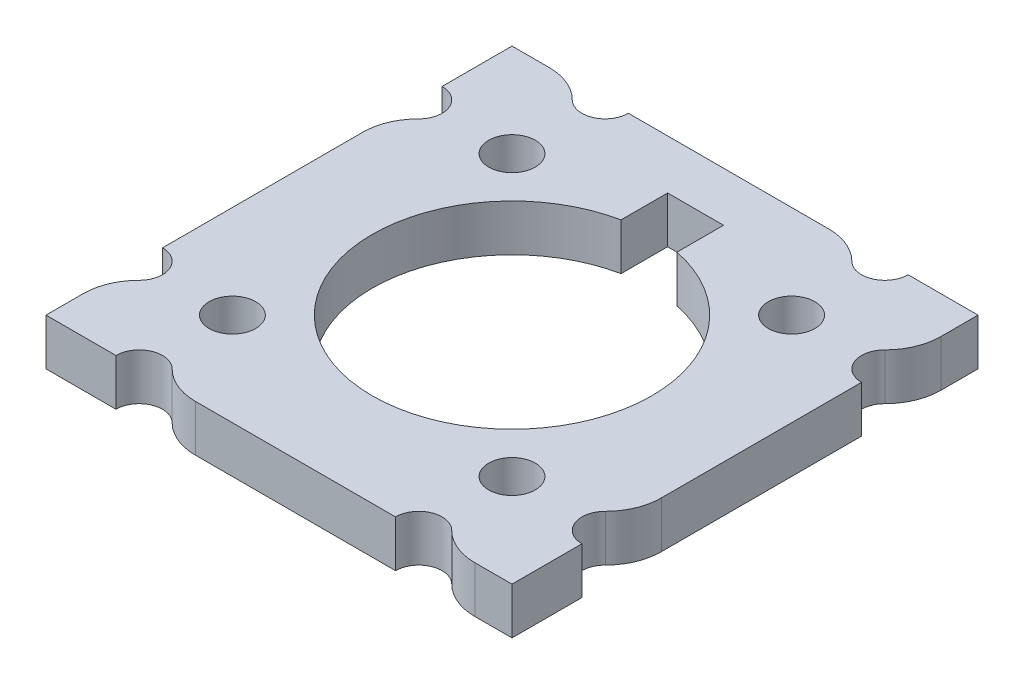
ISO-10303-21;
HEADER;
FILE_DESCRIPTION(('STEP AP214'),'2;1');
FILE_NAME('part.step','',(''),(''),'','','');
FILE_SCHEMA(('AUTOMOTIVE_DESIGN { 1 0 10303 214 1 1 1 1 }'));
ENDSEC;
DATA;
#1=APPLICATION_CONTEXT('core data for automotive mechanical design processes');
#2=APPLICATION_PROTOCOL_DEFINITION('international standard','automotive_design',2000,#1);
#3=PRODUCT_CONTEXT('',#1,'mechanical');
#4=PRODUCT('Part','Part','',(#3));
#5=PRODUCT_RELATED_PRODUCT_CATEGORY('part','',(#4));
#6=PRODUCT_DEFINITION_FORMATION('','',#4);
#7=PRODUCT_DEFINITION_CONTEXT('part definition',#1,'design');
#8=PRODUCT_DEFINITION('design','',#6,#7);
#9=PRODUCT_DEFINITION_SHAPE('','',#8);
#10=(LENGTH_UNIT() NAMED_UNIT(*) SI_UNIT(.MILLI.,.METRE.));
#11=(NAMED_UNIT(*) PLANE_ANGLE_UNIT() SI_UNIT($,.RADIAN.));
#12=(NAMED_UNIT(*) SI_UNIT($,.STERADIAN.) SOLID_ANGLE_UNIT());
#13=UNCERTAINTY_MEASURE_WITH_UNIT(LENGTH_MEASURE(1.E-05),#10,'distance_accuracy_value','');
#14=(GEOMETRIC_REPRESENTATION_CONTEXT(3) GLOBAL_UNCERTAINTY_ASSIGNED_CONTEXT((#13)) GLOBAL_UNIT_ASSIGNED_CONTEXT((#10,
#11,#12)) REPRESENTATION_CONTEXT('',''));
#15=CARTESIAN_POINT('',(0.,0.,0.));
#16=DIRECTION('',(0.,0.,1.));
#17=DIRECTION('',(1.,0.,0.));
#18=AXIS2_PLACEMENT_3D('',#15,#16,#17);
#19=CARTESIAN_POINT('',(25.,5.,-25.));
#20=DIRECTION('',(-1.,0.,0.));
#21=DIRECTION('',(0.,0.,1.));
#22=AXIS2_PLACEMENT_3D('',#19,#20,#21);
#23=PLANE('',#22);
#24=DIRECTION('',(0.,0.,-1.));
#25=VECTOR('',#24,1.);
#26=CARTESIAN_POINT('',(25.,0.,-25.));
#27=LINE('',#26,#25);
#28=CARTESIAN_POINT('',(25.,0.,25.));
#29=VERTEX_POINT('',#28);
#30=CARTESIAN_POINT('',(25.,0.,17.5));
#31=VERTEX_POINT('',#30);
#32=EDGE_CURVE('E420',#29,#31,#27,.T.);
#33=ORIENTED_EDGE('',*,*,#32,.T.);
#34=DIRECTION('',(0.,1.,0.));
#35=VECTOR('',#34,1.);
#36=CARTESIAN_POINT('',(25.,0.,17.5));
#37=LINE('',#36,#35);
#38=CARTESIAN_POINT('',(25.,5.,17.5));
#39=VERTEX_POINT('',#38);
#40=EDGE_CURVE('E486',#31,#39,#37,.T.);
#41=ORIENTED_EDGE('',*,*,#40,.T.);
#42=DIRECTION('',(0.,0.,-1.));
#43=VECTOR('',#42,1.);
#44=CARTESIAN_POINT('',(25.,5.,-25.));
#45=LINE('',#44,#43);
#46=CARTESIAN_POINT('',(25.,5.,25.));
#47=VERTEX_POINT('',#46);
#48=EDGE_CURVE('E395',#47,#39,#45,.T.);
#49=ORIENTED_EDGE('',*,*,#48,.F.);
#50=DIRECTION('',(0.,-1.,0.));
#51=VECTOR('',#50,1.);
#52=CARTESIAN_POINT('',(25.,5.,25.));
#53=LINE('',#52,#51);
#54=EDGE_CURVE('E418',#47,#29,#53,.T.);
#55=ORIENTED_EDGE('',*,*,#54,.T.);
#56=EDGE_LOOP('',(#33,#41,#49,#55));
#57=FACE_BOUND('',#56,.T.);
#58=ADVANCED_FACE('F45',(#57),#23,.F.);
#59=CARTESIAN_POINT('',(25.,5.,8.97920271060383));
#60=VERTEX_POINT('',#59);
#61=CARTESIAN_POINT('',(25.,5.,-12.5));
#62=VERTEX_POINT('',#61);
#63=EDGE_CURVE('E400',#60,#62,#45,.T.);
#64=ORIENTED_EDGE('',*,*,#63,.F.);
#65=DIRECTION('',(0.,1.,0.));
#66=VECTOR('',#65,1.);
#67=CARTESIAN_POINT('',(25.,5.,8.97920271060383));
#68=LINE('',#67,#66);
#69=CARTESIAN_POINT('',(25.,0.,8.97920271060383));
#70=VERTEX_POINT('',#69);
#71=EDGE_CURVE('E578',#60,#70,#68,.F.);
#72=ORIENTED_EDGE('',*,*,#71,.T.);
#73=CARTESIAN_POINT('',(25.,0.,-12.5));
#74=VERTEX_POINT('',#73);
#75=EDGE_CURVE('E425',#70,#74,#27,.T.);
#76=ORIENTED_EDGE('',*,*,#75,.T.);
#77=DIRECTION('',(0.,1.,0.));
#78=VECTOR('',#77,1.);
#79=CARTESIAN_POINT('',(25.,0.,-12.5));
#80=LINE('',#79,#78);
#81=EDGE_CURVE('E482',#74,#62,#80,.T.);
#82=ORIENTED_EDGE('',*,*,#81,.T.);
#83=EDGE_LOOP('',(#64,#72,#76,#82));
#84=FACE_BOUND('',#83,.T.);
#85=ADVANCED_FACE('F633',(#84),#23,.F.);
#86=CARTESIAN_POINT('',(-25.,5.,-25.));
#87=DIRECTION('',(0.,0.,1.));
#88=DIRECTION('',(1.,0.,0.));
#89=AXIS2_PLACEMENT_3D('',#86,#87,#88);
#90=PLANE('',#89);
#91=DIRECTION('',(-1.,0.,0.));
#92=VECTOR('',#91,1.);
#93=CARTESIAN_POINT('',(-25.,5.,-25.));
#94=LINE('',#93,#92);
#95=CARTESIAN_POINT('',(8.97920271060386,5.,-25.));
#96=VERTEX_POINT('',#95);
#97=CARTESIAN_POINT('',(-12.5,5.,-25.));
#98=VERTEX_POINT('',#97);
#99=EDGE_CURVE('E407',#96,#98,#94,.T.);
#100=ORIENTED_EDGE('',*,*,#99,.F.);
#101=DIRECTION('',(0.,1.,0.));
#102=VECTOR('',#101,1.);
#103=CARTESIAN_POINT('',(8.97920271060386,5.,-25.));
#104=LINE('',#103,#102);
#105=CARTESIAN_POINT('',(8.97920271060386,0.,-25.));
#106=VERTEX_POINT('',#105);
#107=EDGE_CURVE('E565',#96,#106,#104,.F.);
#108=ORIENTED_EDGE('',*,*,#107,.T.);
#109=DIRECTION('',(-1.,0.,0.));
#110=VECTOR('',#109,1.);
#111=CARTESIAN_POINT('',(-25.,0.,-25.));
#112=LINE('',#111,#110);
#113=CARTESIAN_POINT('',(-12.5,0.,-25.));
#114=VERTEX_POINT('',#113);
#115=EDGE_CURVE('E431',#106,#114,#112,.T.);
#116=ORIENTED_EDGE('',*,*,#115,.T.);
#117=DIRECTION('',(0.,1.,0.));
#118=VECTOR('',#117,1.);
#119=CARTESIAN_POINT('',(-12.5,0.,-25.));
#120=LINE('',#119,#118);
#121=EDGE_CURVE('E478',#114,#98,#120,.T.);
#122=ORIENTED_EDGE('',*,*,#121,.T.);
#123=EDGE_LOOP('',(#100,#108,#116,#122));
#124=FACE_BOUND('',#123,.T.);
#125=ADVANCED_FACE('F675',(#124),#90,.F.);
#126=CARTESIAN_POINT('',(25.,0.,-25.));
#127=VERTEX_POINT('',#126);
#128=CARTESIAN_POINT('',(17.5,0.,-25.));
#129=VERTEX_POINT('',#128);
#130=EDGE_CURVE('E426',#127,#129,#112,.T.);
#131=ORIENTED_EDGE('',*,*,#130,.T.);
#132=DIRECTION('',(0.,1.,0.));
#133=VECTOR('',#132,1.);
#134=CARTESIAN_POINT('',(17.5,0.,-25.));
#135=LINE('',#134,#133);
#136=CARTESIAN_POINT('',(17.5,5.,-25.));
#137=VERTEX_POINT('',#136);
#138=EDGE_CURVE('E474',#129,#137,#135,.T.);
#139=ORIENTED_EDGE('',*,*,#138,.T.);
#140=CARTESIAN_POINT('',(25.,5.,-25.));
#141=VERTEX_POINT('',#140);
#142=EDGE_CURVE('E402',#141,#137,#94,.T.);
#143=ORIENTED_EDGE('',*,*,#142,.F.);
#144=DIRECTION('',(0.,-1.,0.));
#145=VECTOR('',#144,1.);
#146=CARTESIAN_POINT('',(25.,5.,-25.));
#147=LINE('',#146,#145);
#148=EDGE_CURVE('E454',#141,#127,#147,.T.);
#149=ORIENTED_EDGE('',*,*,#148,.T.);
#150=EDGE_LOOP('',(#131,#139,#143,#149));
#151=FACE_BOUND('',#150,.T.);
#152=ADVANCED_FACE('F648',(#151),#90,.F.);
#153=CARTESIAN_POINT('',(-25.,5.,-25.));
#154=DIRECTION('',(1.,0.,0.));
#155=DIRECTION('',(0.,0.,-1.));
#156=AXIS2_PLACEMENT_3D('',#153,#154,#155);
#157=PLANE('',#156);
#158=DIRECTION('',(0.,0.,1.));
#159=VECTOR('',#158,1.);
#160=CARTESIAN_POINT('',(-25.,5.,-25.));
#161=LINE('',#160,#159);
#162=CARTESIAN_POINT('',(-25.,5.,-8.97920271060368));
#163=VERTEX_POINT('',#162);
#164=CARTESIAN_POINT('',(-25.,5.,12.5000000000003));
#165=VERTEX_POINT('',#164);
#166=EDGE_CURVE('E413',#163,#165,#161,.T.);
#167=ORIENTED_EDGE('',*,*,#166,.F.);
#168=DIRECTION('',(0.,1.,0.));
#169=VECTOR('',#168,1.);
#170=CARTESIAN_POINT('',(-25.,5.,-8.97920271060368));
#171=LINE('',#170,#169);
#172=CARTESIAN_POINT('',(-25.,0.,-8.97920271060368));
#173=VERTEX_POINT('',#172);
#174=EDGE_CURVE('E551',#163,#173,#171,.F.);
#175=ORIENTED_EDGE('',*,*,#174,.T.);
#176=DIRECTION('',(0.,0.,1.));
#177=VECTOR('',#176,1.);
#178=CARTESIAN_POINT('',(-25.,0.,-25.));
#179=LINE('',#178,#177);
#180=CARTESIAN_POINT('',(-25.,0.,12.5000000000003));
#181=VERTEX_POINT('',#180);
#182=EDGE_CURVE('E437',#173,#181,#179,.T.);
#183=ORIENTED_EDGE('',*,*,#182,.T.);
#184=DIRECTION('',(0.,1.,0.));
#185=VECTOR('',#184,1.);
#186=CARTESIAN_POINT('',(-25.,0.,12.5000000000003));
#187=LINE('',#186,#185);
#188=EDGE_CURVE('E470',#181,#165,#187,.T.);
#189=ORIENTED_EDGE('',*,*,#188,.T.);
#190=EDGE_LOOP('',(#167,#175,#183,#189));
#191=FACE_BOUND('',#190,.T.);
#192=ADVANCED_FACE('F700',(#191),#157,.F.);
#193=CARTESIAN_POINT('',(-25.,0.,-25.));
#194=VERTEX_POINT('',#193);
#195=CARTESIAN_POINT('',(-25.,0.,-17.4999999999998));
#196=VERTEX_POINT('',#195);
#197=EDGE_CURVE('E432',#194,#196,#179,.T.);
#198=ORIENTED_EDGE('',*,*,#197,.T.);
#199=DIRECTION('',(0.,1.,0.));
#200=VECTOR('',#199,1.);
#201=CARTESIAN_POINT('',(-25.,0.,-17.4999999999998));
#202=LINE('',#201,#200);
#203=CARTESIAN_POINT('',(-25.,5.,-17.4999999999998));
#204=VERTEX_POINT('',#203);
#205=EDGE_CURVE('E466',#196,#204,#202,.T.);
#206=ORIENTED_EDGE('',*,*,#205,.T.);
#207=CARTESIAN_POINT('',(-25.,5.,-25.));
#208=VERTEX_POINT('',#207);
#209=EDGE_CURVE('E408',#208,#204,#161,.T.);
#210=ORIENTED_EDGE('',*,*,#209,.F.);
#211=DIRECTION('',(0.,-1.,0.));
#212=VECTOR('',#211,1.);
#213=CARTESIAN_POINT('',(-25.,5.,-25.));
#214=LINE('',#213,#212);
#215=EDGE_CURVE('E450',#208,#194,#214,.T.);
#216=ORIENTED_EDGE('',*,*,#215,.T.);
#217=EDGE_LOOP('',(#198,#206,#210,#216));
#218=FACE_BOUND('',#217,.T.);
#219=ADVANCED_FACE('F701',(#218),#157,.F.);
#220=CARTESIAN_POINT('',(-25.,5.,25.));
#221=DIRECTION('',(0.,0.,-1.));
#222=DIRECTION('',(-1.,0.,0.));
#223=AXIS2_PLACEMENT_3D('',#220,#221,#222);
#224=PLANE('',#223);
#225=DIRECTION('',(1.,0.,0.));
#226=VECTOR('',#225,1.);
#227=CARTESIAN_POINT('',(-25.,5.,25.));
#228=LINE('',#227,#226);
#229=CARTESIAN_POINT('',(-8.97920271060385,5.,25.));
#230=VERTEX_POINT('',#229);
#231=CARTESIAN_POINT('',(12.5,5.,25.));
#232=VERTEX_POINT('',#231);
#233=EDGE_CURVE('E419',#230,#232,#228,.T.);
#234=ORIENTED_EDGE('',*,*,#233,.F.);
#235=DIRECTION('',(0.,1.,0.));
#236=VECTOR('',#235,1.);
#237=CARTESIAN_POINT('',(-8.97920271060385,5.,25.));
#238=LINE('',#237,#236);
#239=CARTESIAN_POINT('',(-8.97920271060385,0.,25.));
#240=VERTEX_POINT('',#239);
#241=EDGE_CURVE('E490',#230,#240,#238,.F.);
#242=ORIENTED_EDGE('',*,*,#241,.T.);
#243=DIRECTION('',(1.,0.,0.));
#244=VECTOR('',#243,1.);
#245=CARTESIAN_POINT('',(-25.,0.,25.));
#246=LINE('',#245,#244);
#247=CARTESIAN_POINT('',(12.5,0.,25.));
#248=VERTEX_POINT('',#247);
#249=EDGE_CURVE('E442',#240,#248,#246,.T.);
#250=ORIENTED_EDGE('',*,*,#249,.T.);
#251=DIRECTION('',(0.,1.,0.));
#252=VECTOR('',#251,1.);
#253=CARTESIAN_POINT('',(12.5,0.,25.));
#254=LINE('',#253,#252);
#255=EDGE_CURVE('E462',#248,#232,#254,.T.);
#256=ORIENTED_EDGE('',*,*,#255,.T.);
#257=EDGE_LOOP('',(#234,#242,#250,#256));
#258=FACE_BOUND('',#257,.T.);
#259=ADVANCED_FACE('F604',(#258),#224,.F.);
#260=CARTESIAN_POINT('',(-25.,0.,25.));
#261=VERTEX_POINT('',#260);
#262=CARTESIAN_POINT('',(-17.5,0.,25.));
#263=VERTEX_POINT('',#262);
#264=EDGE_CURVE('E438',#261,#263,#246,.T.);
#265=ORIENTED_EDGE('',*,*,#264,.T.);
#266=DIRECTION('',(0.,1.,0.));
#267=VECTOR('',#266,1.);
#268=CARTESIAN_POINT('',(-17.5,0.,25.));
#269=LINE('',#268,#267);
#270=CARTESIAN_POINT('',(-17.5,5.,25.));
#271=VERTEX_POINT('',#270);
#272=EDGE_CURVE('E458',#263,#271,#269,.T.);
#273=ORIENTED_EDGE('',*,*,#272,.T.);
#274=CARTESIAN_POINT('',(-25.,5.,25.));
#275=VERTEX_POINT('',#274);
#276=EDGE_CURVE('E414',#275,#271,#228,.T.);
#277=ORIENTED_EDGE('',*,*,#276,.F.);
#278=DIRECTION('',(0.,-1.,0.));
#279=VECTOR('',#278,1.);
#280=CARTESIAN_POINT('',(-25.,5.,25.));
#281=LINE('',#280,#279);
#282=EDGE_CURVE('E446',#275,#261,#281,.T.);
#283=ORIENTED_EDGE('',*,*,#282,.T.);
#284=EDGE_LOOP('',(#265,#273,#277,#283));
#285=FACE_BOUND('',#284,.T.);
#286=ADVANCED_FACE('F690',(#285),#224,.F.);
#287=CARTESIAN_POINT('',(0.,5.,0.));
#288=DIRECTION('',(0.,1.,0.));
#289=DIRECTION('',(0.,0.,1.));
#290=AXIS2_PLACEMENT_3D('',#287,#288,#289);
#291=PLANE('',#290);
#292=DIRECTION('',(0.,0.,1.));
#293=VECTOR('',#292,1.);
#294=CARTESIAN_POINT('',(-3.,5.,-19.6969384566991));
#295=LINE('',#294,#293);
#296=CARTESIAN_POINT('',(-3.,5.,-19.6969384566991));
#297=VERTEX_POINT('',#296);
#298=CARTESIAN_POINT('',(-3.,5.,-14.6969384566991));
#299=VERTEX_POINT('',#298);
#300=EDGE_CURVE('E262',#297,#299,#295,.T.);
#301=ORIENTED_EDGE('',*,*,#300,.F.);
#302=DIRECTION('',(-1.,0.,0.));
#303=VECTOR('',#302,1.);
#304=CARTESIAN_POINT('',(-3.,5.,-19.6969384566991));
#305=LINE('',#304,#303);
#306=CARTESIAN_POINT('',(3.,5.,-19.6969384566991));
#307=VERTEX_POINT('',#306);
#308=EDGE_CURVE('E283',#307,#297,#305,.T.);
#309=ORIENTED_EDGE('',*,*,#308,.F.);
#310=DIRECTION('',(0.,0.,-1.));
#311=VECTOR('',#310,1.);
#312=CARTESIAN_POINT('',(3.,5.,-19.6969384566991));
#313=LINE('',#312,#311);
#314=CARTESIAN_POINT('',(3.,5.,-14.6969384566991));
#315=VERTEX_POINT('',#314);
#316=EDGE_CURVE('E287',#315,#307,#313,.T.);
#317=ORIENTED_EDGE('',*,*,#316,.F.);
#318=CARTESIAN_POINT('',(0.,5.,0.));
#319=DIRECTION('',(0.,1.,0.));
#320=DIRECTION('',(0.,0.,1.));
#321=AXIS2_PLACEMENT_3D('',#318,#319,#320);
#322=CIRCLE('',#321,15.);
#323=EDGE_CURVE('E296',#299,#315,#322,.T.);
#324=ORIENTED_EDGE('',*,*,#323,.F.);
#325=EDGE_LOOP('',(#301,#309,#317,#324));
#326=FACE_BOUND('',#325,.T.);
#327=CARTESIAN_POINT('',(-15.,5.,25.));
#328=DIRECTION('',(0.,1.,0.));
#329=DIRECTION('',(0.,0.,-1.));
#330=AXIS2_PLACEMENT_3D('',#327,#328,#329);
#331=CIRCLE('',#330,2.5);
#332=CARTESIAN_POINT('',(-13.2291772678247,5.,23.2352941176471));
#333=VERTEX_POINT('',#332);
#334=EDGE_CURVE('E324',#333,#271,#331,.T.);
#335=ORIENTED_EDGE('',*,*,#334,.F.);
#336=CARTESIAN_POINT('',(-8.97920271060385,5.,19.));
#337=DIRECTION('',(0.,1.,0.));
#338=DIRECTION('',(0.,0.,1.));
#339=AXIS2_PLACEMENT_3D('',#336,#337,#338);
#340=CIRCLE('',#339,6.);
#341=EDGE_CURVE('E541',#333,#230,#340,.T.);
#342=ORIENTED_EDGE('',*,*,#341,.T.);
#343=ORIENTED_EDGE('',*,*,#233,.T.);
#344=CARTESIAN_POINT('',(15.,5.,25.));
#345=DIRECTION('',(0.,1.,0.));
#346=DIRECTION('',(0.,0.,1.));
#347=AXIS2_PLACEMENT_3D('',#344,#345,#346);
#348=CIRCLE('',#347,2.5);
#349=CARTESIAN_POINT('',(16.7708227321753,5.,23.2352941176471));
#350=VERTEX_POINT('',#349);
#351=EDGE_CURVE('E318',#350,#232,#348,.T.);
#352=ORIENTED_EDGE('',*,*,#351,.F.);
#353=CARTESIAN_POINT('',(21.0207972893962,5.,19.));
#354=DIRECTION('',(0.,1.,0.));
#355=DIRECTION('',(0.,0.,1.));
#356=AXIS2_PLACEMENT_3D('',#353,#354,#355);
#357=CIRCLE('',#356,6.);
#358=CARTESIAN_POINT('',(21.0207972893962,5.,25.));
#359=VERTEX_POINT('',#358);
#360=EDGE_CURVE('E521',#350,#359,#357,.T.);
#361=ORIENTED_EDGE('',*,*,#360,.T.);
#362=EDGE_CURVE('E412',#359,#47,#228,.T.);
#363=ORIENTED_EDGE('',*,*,#362,.T.);
#364=ORIENTED_EDGE('',*,*,#48,.T.);
#365=CARTESIAN_POINT('',(25.,5.,15.));
#366=DIRECTION('',(0.,1.,0.));
#367=DIRECTION('',(0.,0.,1.));
#368=AXIS2_PLACEMENT_3D('',#365,#366,#367);
#369=CIRCLE('',#368,2.5);
#370=CARTESIAN_POINT('',(23.2352941176471,5.,13.2291772678246));
#371=VERTEX_POINT('',#370);
#372=EDGE_CURVE('E344',#371,#39,#369,.T.);
#373=ORIENTED_EDGE('',*,*,#372,.F.);
#374=CARTESIAN_POINT('',(19.,5.,8.97920271060383));
#375=DIRECTION('',(0.,1.,0.));
#376=DIRECTION('',(0.,0.,1.));
#377=AXIS2_PLACEMENT_3D('',#374,#375,#376);
#378=CIRCLE('',#377,6.);
#379=EDGE_CURVE('E524',#371,#60,#378,.T.);
#380=ORIENTED_EDGE('',*,*,#379,.T.);
#381=ORIENTED_EDGE('',*,*,#63,.T.);
#382=CARTESIAN_POINT('',(25.,5.,-15.));
#383=DIRECTION('',(0.,1.,0.));
#384=DIRECTION('',(0.,0.,1.));
#385=AXIS2_PLACEMENT_3D('',#382,#383,#384);
#386=CIRCLE('',#385,2.5);
#387=CARTESIAN_POINT('',(23.2352941176471,5.,-16.7708227321754));
#388=VERTEX_POINT('',#387);
#389=EDGE_CURVE('E347',#388,#62,#386,.T.);
#390=ORIENTED_EDGE('',*,*,#389,.F.);
#391=CARTESIAN_POINT('',(19.,5.,-21.0207972893962));
#392=DIRECTION('',(0.,1.,0.));
#393=DIRECTION('',(0.,0.,1.));
#394=AXIS2_PLACEMENT_3D('',#391,#392,#393);
#395=CIRCLE('',#394,6.);
#396=CARTESIAN_POINT('',(25.,5.,-21.0207972893962));
#397=VERTEX_POINT('',#396);
#398=EDGE_CURVE('E527',#388,#397,#395,.T.);
#399=ORIENTED_EDGE('',*,*,#398,.T.);
#400=EDGE_CURVE('E401',#397,#141,#45,.T.);
#401=ORIENTED_EDGE('',*,*,#400,.T.);
#402=ORIENTED_EDGE('',*,*,#142,.T.);
#403=CARTESIAN_POINT('',(15.,5.,-25.));
#404=DIRECTION('',(0.,1.,0.));
#405=DIRECTION('',(0.,0.,-1.));
#406=AXIS2_PLACEMENT_3D('',#403,#404,#405);
#407=CIRCLE('',#406,2.5);
#408=CARTESIAN_POINT('',(13.2291772678247,5.,-23.2352941176471));
#409=VERTEX_POINT('',#408);
#410=EDGE_CURVE('E311',#409,#137,#407,.T.);
#411=ORIENTED_EDGE('',*,*,#410,.F.);
#412=CARTESIAN_POINT('',(8.97920271060386,5.,-19.));
#413=DIRECTION('',(0.,1.,0.));
#414=DIRECTION('',(0.,0.,1.));
#415=AXIS2_PLACEMENT_3D('',#412,#413,#414);
#416=CIRCLE('',#415,6.);
#417=EDGE_CURVE('E61',#409,#96,#416,.T.);
#418=ORIENTED_EDGE('',*,*,#417,.T.);
#419=ORIENTED_EDGE('',*,*,#99,.T.);
#420=CARTESIAN_POINT('',(-15.,5.,-25.));
#421=DIRECTION('',(0.,1.,0.));
#422=DIRECTION('',(0.,0.,1.));
#423=AXIS2_PLACEMENT_3D('',#420,#421,#422);
#424=CIRCLE('',#423,2.5);
#425=CARTESIAN_POINT('',(-16.7708227321753,5.,-23.2352941176471));
#426=VERTEX_POINT('',#425);
#427=EDGE_CURVE('E337',#426,#98,#424,.T.);
#428=ORIENTED_EDGE('',*,*,#427,.F.);
#429=CARTESIAN_POINT('',(-21.0207972893961,5.,-19.));
#430=DIRECTION('',(0.,1.,0.));
#431=DIRECTION('',(0.,0.,1.));
#432=AXIS2_PLACEMENT_3D('',#429,#430,#431);
#433=CIRCLE('',#432,6.);
#434=CARTESIAN_POINT('',(-21.0207972893961,5.,-25.));
#435=VERTEX_POINT('',#434);
#436=EDGE_CURVE('E532',#426,#435,#433,.T.);
#437=ORIENTED_EDGE('',*,*,#436,.T.);
#438=EDGE_CURVE('E399',#435,#208,#94,.T.);
#439=ORIENTED_EDGE('',*,*,#438,.T.);
#440=ORIENTED_EDGE('',*,*,#209,.T.);
#441=CARTESIAN_POINT('',(-25.,5.,-14.9999999999998));
#442=DIRECTION('',(0.,1.,0.));
#443=DIRECTION('',(0.,0.,1.));
#444=AXIS2_PLACEMENT_3D('',#441,#442,#443);
#445=CIRCLE('',#444,2.5);
#446=CARTESIAN_POINT('',(-23.2352941176471,5.,-13.2291772678245));
#447=VERTEX_POINT('',#446);
#448=EDGE_CURVE('E351',#447,#204,#445,.T.);
#449=ORIENTED_EDGE('',*,*,#448,.F.);
#450=CARTESIAN_POINT('',(-19.,5.,-8.97920271060368));
#451=DIRECTION('',(0.,1.,0.));
#452=DIRECTION('',(0.,0.,1.));
#453=AXIS2_PLACEMENT_3D('',#450,#451,#452);
#454=CIRCLE('',#453,6.);
#455=EDGE_CURVE('E535',#447,#163,#454,.T.);
#456=ORIENTED_EDGE('',*,*,#455,.T.);
#457=ORIENTED_EDGE('',*,*,#166,.T.);
#458=CARTESIAN_POINT('',(-25.,5.,15.0000000000003));
#459=DIRECTION('',(0.,1.,0.));
#460=DIRECTION('',(0.,0.,1.));
#461=AXIS2_PLACEMENT_3D('',#458,#459,#460);
#462=CIRCLE('',#461,2.5);
#463=CARTESIAN_POINT('',(-23.2352941176471,5.,16.7708227321757));
#464=VERTEX_POINT('',#463);
#465=EDGE_CURVE('E329',#464,#165,#462,.T.);
#466=ORIENTED_EDGE('',*,*,#465,.F.);
#467=CARTESIAN_POINT('',(-19.,5.,21.0207972893965));
#468=DIRECTION('',(0.,1.,0.));
#469=DIRECTION('',(0.,0.,1.));
#470=AXIS2_PLACEMENT_3D('',#467,#468,#469);
#471=CIRCLE('',#470,6.);
#472=CARTESIAN_POINT('',(-25.,5.,21.0207972893965));
#473=VERTEX_POINT('',#472);
#474=EDGE_CURVE('E538',#464,#473,#471,.T.);
#475=ORIENTED_EDGE('',*,*,#474,.T.);
#476=EDGE_CURVE('E406',#473,#275,#161,.T.);
#477=ORIENTED_EDGE('',*,*,#476,.T.);
#478=ORIENTED_EDGE('',*,*,#276,.T.);
#479=EDGE_LOOP('',(#335,#342,#343,#352,#361,#363,#364,#373,#380,#381,#390,#399,#401,#402,#411,
#418,#419,#428,#437,#439,#440,#449,#456,#457,#466,#475,#477,#478));
#480=FACE_BOUND('',#479,.T.);
#481=CARTESIAN_POINT('',(-15.,5.,15.));
#482=DIRECTION('',(0.,1.,0.));
#483=DIRECTION('',(0.,0.,-1.));
#484=AXIS2_PLACEMENT_3D('',#481,#482,#483);
#485=CIRCLE('',#484,2.5);
#486=CARTESIAN_POINT('',(-15.,5.,12.5));
#487=VERTEX_POINT('',#486);
#488=EDGE_CURVE('E371',#487,#487,#485,.T.);
#489=ORIENTED_EDGE('',*,*,#488,.F.);
#490=EDGE_LOOP('',(#489));
#491=FACE_BOUND('',#490,.T.);
#492=CARTESIAN_POINT('',(15.,5.,-15.));
#493=DIRECTION('',(0.,1.,0.));
#494=DIRECTION('',(0.,0.,1.));
#495=AXIS2_PLACEMENT_3D('',#492,#493,#494);
#496=CIRCLE('',#495,2.5);
#497=CARTESIAN_POINT('',(15.,5.,-12.5));
#498=VERTEX_POINT('',#497);
#499=EDGE_CURVE('E387',#498,#498,#496,.T.);
#500=ORIENTED_EDGE('',*,*,#499,.F.);
#501=EDGE_LOOP('',(#500));
#502=FACE_BOUND('',#501,.T.);
#503=CARTESIAN_POINT('',(15.,5.,15.));
#504=DIRECTION('',(0.,1.,0.));
#505=DIRECTION('',(0.,0.,1.));
#506=AXIS2_PLACEMENT_3D('',#503,#504,#505);
#507=CIRCLE('',#506,2.5);
#508=CARTESIAN_POINT('',(15.,5.,17.5));
#509=VERTEX_POINT('',#508);
#510=EDGE_CURVE('E379',#509,#509,#507,.T.);
#511=ORIENTED_EDGE('',*,*,#510,.F.);
#512=EDGE_LOOP('',(#511));
#513=FACE_BOUND('',#512,.T.);
#514=CARTESIAN_POINT('',(-15.,5.,-15.));
#515=DIRECTION('',(0.,1.,0.));
#516=DIRECTION('',(0.,0.,-1.));
#517=AXIS2_PLACEMENT_3D('',#514,#515,#516);
#518=CIRCLE('',#517,2.5);
#519=CARTESIAN_POINT('',(-15.,5.,-17.5));
#520=VERTEX_POINT('',#519);
#521=EDGE_CURVE('E363',#520,#520,#518,.T.);
#522=ORIENTED_EDGE('',*,*,#521,.F.);
#523=EDGE_LOOP('',(#522));
#524=FACE_BOUND('',#523,.T.);
#525=ADVANCED_FACE('F612',(#326,#480,#491,#502,#513,#524),#291,.T.);
#526=CARTESIAN_POINT('',(0.,0.,0.));
#527=DIRECTION('',(0.,1.,0.));
#528=DIRECTION('',(0.,0.,1.));
#529=AXIS2_PLACEMENT_3D('',#526,#527,#528);
#530=PLANE('',#529);
#531=DIRECTION('',(-1.,0.,0.));
#532=VECTOR('',#531,1.);
#533=CARTESIAN_POINT('',(-3.,0.,-19.6969384566991));
#534=LINE('',#533,#532);
#535=CARTESIAN_POINT('',(3.,0.,-19.6969384566991));
#536=VERTEX_POINT('',#535);
#537=CARTESIAN_POINT('',(-3.,0.,-19.6969384566991));
#538=VERTEX_POINT('',#537);
#539=EDGE_CURVE('E268',#536,#538,#534,.T.);
#540=ORIENTED_EDGE('',*,*,#539,.T.);
#541=DIRECTION('',(0.,0.,1.));
#542=VECTOR('',#541,1.);
#543=CARTESIAN_POINT('',(-3.,0.,-19.6969384566991));
#544=LINE('',#543,#542);
#545=CARTESIAN_POINT('',(-3.,0.,-14.6969384566991));
#546=VERTEX_POINT('',#545);
#547=EDGE_CURVE('E259',#538,#546,#544,.T.);
#548=ORIENTED_EDGE('',*,*,#547,.T.);
#549=CARTESIAN_POINT('',(0.,0.,0.));
#550=DIRECTION('',(0.,1.,0.));
#551=DIRECTION('',(0.,0.,1.));
#552=AXIS2_PLACEMENT_3D('',#549,#550,#551);
#553=CIRCLE('',#552,15.);
#554=CARTESIAN_POINT('',(3.,0.,-14.6969384566991));
#555=VERTEX_POINT('',#554);
#556=EDGE_CURVE('E272',#546,#555,#553,.T.);
#557=ORIENTED_EDGE('',*,*,#556,.T.);
#558=DIRECTION('',(0.,0.,-1.));
#559=VECTOR('',#558,1.);
#560=CARTESIAN_POINT('',(3.,0.,-19.6969384566991));
#561=LINE('',#560,#559);
#562=EDGE_CURVE('E277',#555,#536,#561,.T.);
#563=ORIENTED_EDGE('',*,*,#562,.T.);
#564=EDGE_LOOP('',(#540,#548,#557,#563));
#565=FACE_BOUND('',#564,.T.);
#566=ORIENTED_EDGE('',*,*,#249,.F.);
#567=CARTESIAN_POINT('',(-8.97920271060385,0.,19.));
#568=DIRECTION('',(0.,1.,0.));
#569=DIRECTION('',(0.,0.,1.));
#570=AXIS2_PLACEMENT_3D('',#567,#568,#569);
#571=CIRCLE('',#570,6.);
#572=CARTESIAN_POINT('',(-13.2291772678247,0.,23.2352941176471));
#573=VERTEX_POINT('',#572);
#574=EDGE_CURVE('E515',#240,#573,#571,.F.);
#575=ORIENTED_EDGE('',*,*,#574,.T.);
#576=CARTESIAN_POINT('',(-15.,0.,25.));
#577=DIRECTION('',(0.,1.,0.));
#578=DIRECTION('',(0.,0.,-1.));
#579=AXIS2_PLACEMENT_3D('',#576,#577,#578);
#580=CIRCLE('',#579,2.5);
#581=EDGE_CURVE('E305',#573,#263,#580,.T.);
#582=ORIENTED_EDGE('',*,*,#581,.T.);
#583=ORIENTED_EDGE('',*,*,#264,.F.);
#584=CARTESIAN_POINT('',(-25.,0.,21.0207972893965));
#585=VERTEX_POINT('',#584);
#586=EDGE_CURVE('E430',#585,#261,#179,.T.);
#587=ORIENTED_EDGE('',*,*,#586,.F.);
#588=CARTESIAN_POINT('',(-19.,0.,21.0207972893965));
#589=DIRECTION('',(0.,1.,0.));
#590=DIRECTION('',(0.,0.,1.));
#591=AXIS2_PLACEMENT_3D('',#588,#589,#590);
#592=CIRCLE('',#591,6.);
#593=CARTESIAN_POINT('',(-23.2352941176471,0.,16.7708227321757));
#594=VERTEX_POINT('',#593);
#595=EDGE_CURVE('E512',#585,#594,#592,.F.);
#596=ORIENTED_EDGE('',*,*,#595,.T.);
#597=CARTESIAN_POINT('',(-25.,0.,15.0000000000003));
#598=DIRECTION('',(0.,1.,0.));
#599=DIRECTION('',(0.,0.,1.));
#600=AXIS2_PLACEMENT_3D('',#597,#598,#599);
#601=CIRCLE('',#600,2.5);
#602=EDGE_CURVE('E333',#594,#181,#601,.T.);
#603=ORIENTED_EDGE('',*,*,#602,.T.);
#604=ORIENTED_EDGE('',*,*,#182,.F.);
#605=CARTESIAN_POINT('',(-19.,0.,-8.97920271060368));
#606=DIRECTION('',(0.,1.,0.));
#607=DIRECTION('',(0.,0.,1.));
#608=AXIS2_PLACEMENT_3D('',#605,#606,#607);
#609=CIRCLE('',#608,6.);
#610=CARTESIAN_POINT('',(-23.2352941176471,0.,-13.2291772678245));
#611=VERTEX_POINT('',#610);
#612=EDGE_CURVE('E509',#173,#611,#609,.F.);
#613=ORIENTED_EDGE('',*,*,#612,.T.);
#614=CARTESIAN_POINT('',(-25.,0.,-14.9999999999998));
#615=DIRECTION('',(0.,1.,0.));
#616=DIRECTION('',(0.,0.,1.));
#617=AXIS2_PLACEMENT_3D('',#614,#615,#616);
#618=CIRCLE('',#617,2.5);
#619=EDGE_CURVE('E332',#611,#196,#618,.T.);
#620=ORIENTED_EDGE('',*,*,#619,.T.);
#621=ORIENTED_EDGE('',*,*,#197,.F.);
#622=CARTESIAN_POINT('',(-21.0207972893961,0.,-25.));
#623=VERTEX_POINT('',#622);
#624=EDGE_CURVE('E424',#623,#194,#112,.T.);
#625=ORIENTED_EDGE('',*,*,#624,.F.);
#626=CARTESIAN_POINT('',(-21.0207972893961,0.,-19.));
#627=DIRECTION('',(0.,1.,0.));
#628=DIRECTION('',(0.,0.,1.));
#629=AXIS2_PLACEMENT_3D('',#626,#627,#628);
#630=CIRCLE('',#629,6.);
#631=CARTESIAN_POINT('',(-16.7708227321753,0.,-23.2352941176471));
#632=VERTEX_POINT('',#631);
#633=EDGE_CURVE('E506',#623,#632,#630,.F.);
#634=ORIENTED_EDGE('',*,*,#633,.T.);
#635=CARTESIAN_POINT('',(-15.,0.,-25.));
#636=DIRECTION('',(0.,1.,0.));
#637=DIRECTION('',(0.,0.,1.));
#638=AXIS2_PLACEMENT_3D('',#635,#636,#637);
#639=CIRCLE('',#638,2.5);
#640=EDGE_CURVE('E314',#632,#114,#639,.T.);
#641=ORIENTED_EDGE('',*,*,#640,.T.);
#642=ORIENTED_EDGE('',*,*,#115,.F.);
#643=CARTESIAN_POINT('',(8.97920271060386,0.,-19.));
#644=DIRECTION('',(0.,1.,0.));
#645=DIRECTION('',(0.,0.,1.));
#646=AXIS2_PLACEMENT_3D('',#643,#644,#645);
#647=CIRCLE('',#646,6.);
#648=CARTESIAN_POINT('',(13.2291772678247,0.,-23.2352941176471));
#649=VERTEX_POINT('',#648);
#650=EDGE_CURVE('E503',#106,#649,#647,.F.);
#651=ORIENTED_EDGE('',*,*,#650,.T.);
#652=CARTESIAN_POINT('',(15.,0.,-25.));
#653=DIRECTION('',(0.,1.,0.));
#654=DIRECTION('',(0.,0.,-1.));
#655=AXIS2_PLACEMENT_3D('',#652,#653,#654);
#656=CIRCLE('',#655,2.5);
#657=EDGE_CURVE('E315',#649,#129,#656,.T.);
#658=ORIENTED_EDGE('',*,*,#657,.T.);
#659=ORIENTED_EDGE('',*,*,#130,.F.);
#660=CARTESIAN_POINT('',(25.,0.,-21.0207972893962));
#661=VERTEX_POINT('',#660);
#662=EDGE_CURVE('E391',#661,#127,#27,.T.);
#663=ORIENTED_EDGE('',*,*,#662,.F.);
#664=CARTESIAN_POINT('',(19.,0.,-21.0207972893962));
#665=DIRECTION('',(0.,1.,0.));
#666=DIRECTION('',(0.,0.,1.));
#667=AXIS2_PLACEMENT_3D('',#664,#665,#666);
#668=CIRCLE('',#667,6.);
#669=CARTESIAN_POINT('',(23.2352941176471,0.,-16.7708227321754));
#670=VERTEX_POINT('',#669);
#671=EDGE_CURVE('E500',#661,#670,#668,.F.);
#672=ORIENTED_EDGE('',*,*,#671,.T.);
#673=CARTESIAN_POINT('',(25.,0.,-15.));
#674=DIRECTION('',(0.,1.,0.));
#675=DIRECTION('',(0.,0.,1.));
#676=AXIS2_PLACEMENT_3D('',#673,#674,#675);
#677=CIRCLE('',#676,2.5);
#678=EDGE_CURVE('E356',#670,#74,#677,.T.);
#679=ORIENTED_EDGE('',*,*,#678,.T.);
#680=ORIENTED_EDGE('',*,*,#75,.F.);
#681=CARTESIAN_POINT('',(19.,0.,8.97920271060383));
#682=DIRECTION('',(0.,1.,0.));
#683=DIRECTION('',(0.,0.,1.));
#684=AXIS2_PLACEMENT_3D('',#681,#682,#683);
#685=CIRCLE('',#684,6.);
#686=CARTESIAN_POINT('',(23.2352941176471,0.,13.2291772678246));
#687=VERTEX_POINT('',#686);
#688=EDGE_CURVE('E497',#70,#687,#685,.F.);
#689=ORIENTED_EDGE('',*,*,#688,.T.);
#690=CARTESIAN_POINT('',(25.,0.,15.));
#691=DIRECTION('',(0.,1.,0.));
#692=DIRECTION('',(0.,0.,1.));
#693=AXIS2_PLACEMENT_3D('',#690,#691,#692);
#694=CIRCLE('',#693,2.5);
#695=EDGE_CURVE('E348',#687,#31,#694,.T.);
#696=ORIENTED_EDGE('',*,*,#695,.T.);
#697=ORIENTED_EDGE('',*,*,#32,.F.);
#698=CARTESIAN_POINT('',(21.0207972893962,0.,25.));
#699=VERTEX_POINT('',#698);
#700=EDGE_CURVE('E436',#699,#29,#246,.T.);
#701=ORIENTED_EDGE('',*,*,#700,.F.);
#702=CARTESIAN_POINT('',(21.0207972893962,0.,19.));
#703=DIRECTION('',(0.,1.,0.));
#704=DIRECTION('',(0.,0.,1.));
#705=AXIS2_PLACEMENT_3D('',#702,#703,#704);
#706=CIRCLE('',#705,6.);
#707=CARTESIAN_POINT('',(16.7708227321753,0.,23.2352941176471));
#708=VERTEX_POINT('',#707);
#709=EDGE_CURVE('E494',#699,#708,#706,.F.);
#710=ORIENTED_EDGE('',*,*,#709,.T.);
#711=CARTESIAN_POINT('',(15.,0.,25.));
#712=DIRECTION('',(0.,1.,0.));
#713=DIRECTION('',(0.,0.,1.));
#714=AXIS2_PLACEMENT_3D('',#711,#712,#713);
#715=CIRCLE('',#714,2.5);
#716=EDGE_CURVE('E321',#708,#248,#715,.T.);
#717=ORIENTED_EDGE('',*,*,#716,.T.);
#718=EDGE_LOOP('',(#566,#575,#582,#583,#587,#596,#603,#604,#613,#620,#621,#625,#634,#641,#642,
#651,#658,#659,#663,#672,#679,#680,#689,#696,#697,#701,#710,#717));
#719=FACE_BOUND('',#718,.T.);
#720=CARTESIAN_POINT('',(15.,0.,-15.));
#721=DIRECTION('',(0.,1.,0.));
#722=DIRECTION('',(0.,0.,1.));
#723=AXIS2_PLACEMENT_3D('',#720,#721,#722);
#724=CIRCLE('',#723,2.5);
#725=CARTESIAN_POINT('',(15.,0.,-12.5));
#726=VERTEX_POINT('',#725);
#727=EDGE_CURVE('E383',#726,#726,#724,.T.);
#728=ORIENTED_EDGE('',*,*,#727,.T.);
#729=EDGE_LOOP('',(#728));
#730=FACE_BOUND('',#729,.T.);
#731=CARTESIAN_POINT('',(15.,0.,15.));
#732=DIRECTION('',(0.,1.,0.));
#733=DIRECTION('',(0.,0.,1.));
#734=AXIS2_PLACEMENT_3D('',#731,#732,#733);
#735=CIRCLE('',#734,2.5);
#736=CARTESIAN_POINT('',(15.,0.,17.5));
#737=VERTEX_POINT('',#736);
#738=EDGE_CURVE('E375',#737,#737,#735,.T.);
#739=ORIENTED_EDGE('',*,*,#738,.T.);
#740=EDGE_LOOP('',(#739));
#741=FACE_BOUND('',#740,.T.);
#742=CARTESIAN_POINT('',(-15.,0.,15.));
#743=DIRECTION('',(0.,1.,0.));
#744=DIRECTION('',(0.,0.,-1.));
#745=AXIS2_PLACEMENT_3D('',#742,#743,#744);
#746=CIRCLE('',#745,2.5);
#747=CARTESIAN_POINT('',(-15.,0.,12.5));
#748=VERTEX_POINT('',#747);
#749=EDGE_CURVE('E367',#748,#748,#746,.T.);
#750=ORIENTED_EDGE('',*,*,#749,.T.);
#751=EDGE_LOOP('',(#750));
#752=FACE_BOUND('',#751,.T.);
#753=CARTESIAN_POINT('',(-15.,0.,-15.));
#754=DIRECTION('',(0.,1.,0.));
#755=DIRECTION('',(0.,0.,-1.));
#756=AXIS2_PLACEMENT_3D('',#753,#754,#755);
#757=CIRCLE('',#756,2.5);
#758=CARTESIAN_POINT('',(-15.,0.,-17.5));
#759=VERTEX_POINT('',#758);
#760=EDGE_CURVE('E360',#759,#759,#757,.T.);
#761=ORIENTED_EDGE('',*,*,#760,.T.);
#762=EDGE_LOOP('',(#761));
#763=FACE_BOUND('',#762,.T.);
#764=ADVANCED_FACE('F279',(#565,#719,#730,#741,#752,#763),#530,.F.);
#765=ORIENTED_EDGE('',*,*,#400,.F.);
#766=DIRECTION('',(0.,1.,0.));
#767=VECTOR('',#766,1.);
#768=CARTESIAN_POINT('',(25.,5.,-21.0207972893962));
#769=LINE('',#768,#767);
#770=EDGE_CURVE('E571',#397,#661,#769,.F.);
#771=ORIENTED_EDGE('',*,*,#770,.T.);
#772=ORIENTED_EDGE('',*,*,#662,.T.);
#773=ORIENTED_EDGE('',*,*,#148,.F.);
#774=EDGE_LOOP('',(#765,#771,#772,#773));
#775=FACE_BOUND('',#774,.T.);
#776=ADVANCED_FACE('F643',(#775),#23,.F.);
#777=ORIENTED_EDGE('',*,*,#438,.F.);
#778=DIRECTION('',(0.,1.,0.));
#779=VECTOR('',#778,1.);
#780=CARTESIAN_POINT('',(-21.0207972893961,5.,-25.));
#781=LINE('',#780,#779);
#782=EDGE_CURVE('E558',#435,#623,#781,.F.);
#783=ORIENTED_EDGE('',*,*,#782,.T.);
#784=ORIENTED_EDGE('',*,*,#624,.T.);
#785=ORIENTED_EDGE('',*,*,#215,.F.);
#786=EDGE_LOOP('',(#777,#783,#784,#785));
#787=FACE_BOUND('',#786,.T.);
#788=ADVANCED_FACE('F679',(#787),#90,.F.);
#789=ORIENTED_EDGE('',*,*,#476,.F.);
#790=DIRECTION('',(0.,1.,0.));
#791=VECTOR('',#790,1.);
#792=CARTESIAN_POINT('',(-25.,5.,21.0207972893965));
#793=LINE('',#792,#791);
#794=EDGE_CURVE('E544',#473,#585,#793,.F.);
#795=ORIENTED_EDGE('',*,*,#794,.T.);
#796=ORIENTED_EDGE('',*,*,#586,.T.);
#797=ORIENTED_EDGE('',*,*,#282,.F.);
#798=EDGE_LOOP('',(#789,#795,#796,#797));
#799=FACE_BOUND('',#798,.T.);
#800=ADVANCED_FACE('F684',(#799),#157,.F.);
#801=ORIENTED_EDGE('',*,*,#362,.F.);
#802=DIRECTION('',(0.,1.,0.));
#803=VECTOR('',#802,1.);
#804=CARTESIAN_POINT('',(21.0207972893962,5.,25.));
#805=LINE('',#804,#803);
#806=EDGE_CURVE('E54',#359,#699,#805,.F.);
#807=ORIENTED_EDGE('',*,*,#806,.T.);
#808=ORIENTED_EDGE('',*,*,#700,.T.);
#809=ORIENTED_EDGE('',*,*,#54,.F.);
#810=EDGE_LOOP('',(#801,#807,#808,#809));
#811=FACE_BOUND('',#810,.T.);
#812=ADVANCED_FACE('F590',(#811),#224,.F.);
#813=CARTESIAN_POINT('',(15.,5.,-15.));
#814=DIRECTION('',(0.,-1.,0.));
#815=DIRECTION('',(0.,0.,-1.));
#816=AXIS2_PLACEMENT_3D('',#813,#814,#815);
#817=CYLINDRICAL_SURFACE('',#816,2.5);
#818=ORIENTED_EDGE('',*,*,#499,.T.);
#819=EDGE_LOOP('',(#818));
#820=FACE_BOUND('',#819,.T.);
#821=ORIENTED_EDGE('',*,*,#727,.F.);
#822=EDGE_LOOP('',(#821));
#823=FACE_BOUND('',#822,.T.);
#824=ADVANCED_FACE('F697',(#820,#823),#817,.F.);
#825=CARTESIAN_POINT('',(15.,5.,15.));
#826=DIRECTION('',(0.,-1.,0.));
#827=DIRECTION('',(0.,0.,-1.));
#828=AXIS2_PLACEMENT_3D('',#825,#826,#827);
#829=CYLINDRICAL_SURFACE('',#828,2.5);
#830=ORIENTED_EDGE('',*,*,#510,.T.);
#831=EDGE_LOOP('',(#830));
#832=FACE_BOUND('',#831,.T.);
#833=ORIENTED_EDGE('',*,*,#738,.F.);
#834=EDGE_LOOP('',(#833));
#835=FACE_BOUND('',#834,.T.);
#836=ADVANCED_FACE('F812',(#832,#835),#829,.F.);
#837=CARTESIAN_POINT('',(-15.,5.,15.));
#838=DIRECTION('',(0.,-1.,0.));
#839=DIRECTION('',(0.,0.,-1.));
#840=AXIS2_PLACEMENT_3D('',#837,#838,#839);
#841=CYLINDRICAL_SURFACE('',#840,2.5);
#842=ORIENTED_EDGE('',*,*,#488,.T.);
#843=EDGE_LOOP('',(#842));
#844=FACE_BOUND('',#843,.T.);
#845=ORIENTED_EDGE('',*,*,#749,.F.);
#846=EDGE_LOOP('',(#845));
#847=FACE_BOUND('',#846,.T.);
#848=ADVANCED_FACE('F808',(#844,#847),#841,.F.);
#849=CARTESIAN_POINT('',(-15.,5.,-15.));
#850=DIRECTION('',(0.,-1.,0.));
#851=DIRECTION('',(0.,0.,-1.));
#852=AXIS2_PLACEMENT_3D('',#849,#850,#851);
#853=CYLINDRICAL_SURFACE('',#852,2.5);
#854=ORIENTED_EDGE('',*,*,#521,.T.);
#855=EDGE_LOOP('',(#854));
#856=FACE_BOUND('',#855,.T.);
#857=ORIENTED_EDGE('',*,*,#760,.F.);
#858=EDGE_LOOP('',(#857));
#859=FACE_BOUND('',#858,.T.);
#860=ADVANCED_FACE('F799',(#856,#859),#853,.F.);
#861=CARTESIAN_POINT('',(-15.,0.,25.));
#862=DIRECTION('',(0.,1.,0.));
#863=DIRECTION('',(0.,0.,1.));
#864=AXIS2_PLACEMENT_3D('',#861,#862,#863);
#865=CYLINDRICAL_SURFACE('',#864,2.5);
#866=ORIENTED_EDGE('',*,*,#581,.F.);
#867=DIRECTION('',(0.,1.,0.));
#868=VECTOR('',#867,1.);
#869=CARTESIAN_POINT('',(-13.2291772678247,0.,23.2352941176471));
#870=LINE('',#869,#868);
#871=EDGE_CURVE('E518',#573,#333,#870,.T.);
#872=ORIENTED_EDGE('',*,*,#871,.T.);
#873=ORIENTED_EDGE('',*,*,#334,.T.);
#874=ORIENTED_EDGE('',*,*,#272,.F.);
#875=EDGE_LOOP('',(#866,#872,#873,#874));
#876=FACE_BOUND('',#875,.T.);
#877=ADVANCED_FACE('F744',(#876),#865,.F.);
#878=CARTESIAN_POINT('',(15.,0.,25.));
#879=DIRECTION('',(0.,1.,0.));
#880=DIRECTION('',(0.,0.,1.));
#881=AXIS2_PLACEMENT_3D('',#878,#879,#880);
#882=CYLINDRICAL_SURFACE('',#881,2.5);
#883=ORIENTED_EDGE('',*,*,#716,.F.);
#884=DIRECTION('',(0.,1.,0.));
#885=VECTOR('',#884,1.);
#886=CARTESIAN_POINT('',(16.7708227321753,0.,23.2352941176471));
#887=LINE('',#886,#885);
#888=EDGE_CURVE('E11',#708,#350,#887,.T.);
#889=ORIENTED_EDGE('',*,*,#888,.T.);
#890=ORIENTED_EDGE('',*,*,#351,.T.);
#891=ORIENTED_EDGE('',*,*,#255,.F.);
#892=EDGE_LOOP('',(#883,#889,#890,#891));
#893=FACE_BOUND('',#892,.T.);
#894=ADVANCED_FACE('F607',(#893),#882,.F.);
#895=CARTESIAN_POINT('',(-25.,0.,-14.9999999999998));
#896=DIRECTION('',(0.,1.,0.));
#897=DIRECTION('',(0.,0.,1.));
#898=AXIS2_PLACEMENT_3D('',#895,#896,#897);
#899=CYLINDRICAL_SURFACE('',#898,2.5);
#900=ORIENTED_EDGE('',*,*,#619,.F.);
#901=DIRECTION('',(0.,1.,0.));
#902=VECTOR('',#901,1.);
#903=CARTESIAN_POINT('',(-23.2352941176471,0.,-13.2291772678245));
#904=LINE('',#903,#902);
#905=EDGE_CURVE('E555',#611,#447,#904,.T.);
#906=ORIENTED_EDGE('',*,*,#905,.T.);
#907=ORIENTED_EDGE('',*,*,#448,.T.);
#908=ORIENTED_EDGE('',*,*,#205,.F.);
#909=EDGE_LOOP('',(#900,#906,#907,#908));
#910=FACE_BOUND('',#909,.T.);
#911=ADVANCED_FACE('F722',(#910),#899,.F.);
#912=CARTESIAN_POINT('',(-25.,0.,15.0000000000003));
#913=DIRECTION('',(0.,1.,0.));
#914=DIRECTION('',(0.,0.,1.));
#915=AXIS2_PLACEMENT_3D('',#912,#913,#914);
#916=CYLINDRICAL_SURFACE('',#915,2.5);
#917=ORIENTED_EDGE('',*,*,#602,.F.);
#918=DIRECTION('',(0.,1.,0.));
#919=VECTOR('',#918,1.);
#920=CARTESIAN_POINT('',(-23.2352941176471,0.,16.7708227321757));
#921=LINE('',#920,#919);
#922=EDGE_CURVE('E548',#594,#464,#921,.T.);
#923=ORIENTED_EDGE('',*,*,#922,.T.);
#924=ORIENTED_EDGE('',*,*,#465,.T.);
#925=ORIENTED_EDGE('',*,*,#188,.F.);
#926=EDGE_LOOP('',(#917,#923,#924,#925));
#927=FACE_BOUND('',#926,.T.);
#928=ADVANCED_FACE('F750',(#927),#916,.F.);
#929=CARTESIAN_POINT('',(15.,0.,-25.));
#930=DIRECTION('',(0.,1.,0.));
#931=DIRECTION('',(0.,0.,1.));
#932=AXIS2_PLACEMENT_3D('',#929,#930,#931);
#933=CYLINDRICAL_SURFACE('',#932,2.5);
#934=ORIENTED_EDGE('',*,*,#657,.F.);
#935=DIRECTION('',(0.,1.,0.));
#936=VECTOR('',#935,1.);
#937=CARTESIAN_POINT('',(13.2291772678247,0.,-23.2352941176471));
#938=LINE('',#937,#936);
#939=EDGE_CURVE('E69',#649,#409,#938,.T.);
#940=ORIENTED_EDGE('',*,*,#939,.T.);
#941=ORIENTED_EDGE('',*,*,#410,.T.);
#942=ORIENTED_EDGE('',*,*,#138,.F.);
#943=EDGE_LOOP('',(#934,#940,#941,#942));
#944=FACE_BOUND('',#943,.T.);
#945=ADVANCED_FACE('F784',(#944),#933,.F.);
#946=CARTESIAN_POINT('',(-15.,0.,-25.));
#947=DIRECTION('',(0.,1.,0.));
#948=DIRECTION('',(0.,0.,1.));
#949=AXIS2_PLACEMENT_3D('',#946,#947,#948);
#950=CYLINDRICAL_SURFACE('',#949,2.5);
#951=ORIENTED_EDGE('',*,*,#640,.F.);
#952=DIRECTION('',(0.,1.,0.));
#953=VECTOR('',#952,1.);
#954=CARTESIAN_POINT('',(-16.7708227321753,0.,-23.2352941176471));
#955=LINE('',#954,#953);
#956=EDGE_CURVE('E562',#632,#426,#955,.T.);
#957=ORIENTED_EDGE('',*,*,#956,.T.);
#958=ORIENTED_EDGE('',*,*,#427,.T.);
#959=ORIENTED_EDGE('',*,*,#121,.F.);
#960=EDGE_LOOP('',(#951,#957,#958,#959));
#961=FACE_BOUND('',#960,.T.);
#962=ADVANCED_FACE('F780',(#961),#950,.F.);
#963=CARTESIAN_POINT('',(25.,0.,-15.));
#964=DIRECTION('',(0.,1.,0.));
#965=DIRECTION('',(0.,0.,1.));
#966=AXIS2_PLACEMENT_3D('',#963,#964,#965);
#967=CYLINDRICAL_SURFACE('',#966,2.5);
#968=ORIENTED_EDGE('',*,*,#678,.F.);
#969=DIRECTION('',(0.,1.,0.));
#970=VECTOR('',#969,1.);
#971=CARTESIAN_POINT('',(23.2352941176471,0.,-16.7708227321754));
#972=LINE('',#971,#970);
#973=EDGE_CURVE('E575',#670,#388,#972,.T.);
#974=ORIENTED_EDGE('',*,*,#973,.T.);
#975=ORIENTED_EDGE('',*,*,#389,.T.);
#976=ORIENTED_EDGE('',*,*,#81,.F.);
#977=EDGE_LOOP('',(#968,#974,#975,#976));
#978=FACE_BOUND('',#977,.T.);
#979=ADVANCED_FACE('F654',(#978),#967,.F.);
#980=CARTESIAN_POINT('',(25.,0.,15.));
#981=DIRECTION('',(0.,1.,0.));
#982=DIRECTION('',(0.,0.,1.));
#983=AXIS2_PLACEMENT_3D('',#980,#981,#982);
#984=CYLINDRICAL_SURFACE('',#983,2.5);
#985=ORIENTED_EDGE('',*,*,#695,.F.);
#986=DIRECTION('',(0.,1.,0.));
#987=VECTOR('',#986,1.);
#988=CARTESIAN_POINT('',(23.2352941176471,0.,13.2291772678246));
#989=LINE('',#988,#987);
#990=EDGE_CURVE('E582',#687,#371,#989,.T.);
#991=ORIENTED_EDGE('',*,*,#990,.T.);
#992=ORIENTED_EDGE('',*,*,#372,.T.);
#993=ORIENTED_EDGE('',*,*,#40,.F.);
#994=EDGE_LOOP('',(#985,#991,#992,#993));
#995=FACE_BOUND('',#994,.T.);
#996=ADVANCED_FACE('F623',(#995),#984,.F.);
#997=CARTESIAN_POINT('',(-3.,0.,-19.6969384566991));
#998=DIRECTION('',(-1.,0.,0.));
#999=DIRECTION('',(0.,0.,1.));
#1000=AXIS2_PLACEMENT_3D('',#997,#998,#999);
#1001=PLANE('',#1000);
#1002=ORIENTED_EDGE('',*,*,#300,.T.);
#1003=DIRECTION('',(0.,1.,0.));
#1004=VECTOR('',#1003,1.);
#1005=CARTESIAN_POINT('',(-3.,0.,-14.6969384566991));
#1006=LINE('',#1005,#1004);
#1007=EDGE_CURVE('E255',#546,#299,#1006,.T.);
#1008=ORIENTED_EDGE('',*,*,#1007,.F.);
#1009=ORIENTED_EDGE('',*,*,#547,.F.);
#1010=DIRECTION('',(0.,1.,0.));
#1011=VECTOR('',#1010,1.);
#1012=CARTESIAN_POINT('',(-3.,0.,-19.6969384566991));
#1013=LINE('',#1012,#1011);
#1014=EDGE_CURVE('E302',#538,#297,#1013,.T.);
#1015=ORIENTED_EDGE('',*,*,#1014,.T.);
#1016=EDGE_LOOP('',(#1002,#1008,#1009,#1015));
#1017=FACE_BOUND('',#1016,.T.);
#1018=ADVANCED_FACE('F257',(#1017),#1001,.F.);
#1019=CARTESIAN_POINT('',(-3.,0.,-19.6969384566991));
#1020=DIRECTION('',(0.,0.,-1.));
#1021=DIRECTION('',(-1.,0.,0.));
#1022=AXIS2_PLACEMENT_3D('',#1019,#1020,#1021);
#1023=PLANE('',#1022);
#1024=ORIENTED_EDGE('',*,*,#308,.T.);
#1025=ORIENTED_EDGE('',*,*,#1014,.F.);
#1026=ORIENTED_EDGE('',*,*,#539,.F.);
#1027=DIRECTION('',(0.,1.,0.));
#1028=VECTOR('',#1027,1.);
#1029=CARTESIAN_POINT('',(3.,0.,-19.6969384566991));
#1030=LINE('',#1029,#1028);
#1031=EDGE_CURVE('E306',#536,#307,#1030,.T.);
#1032=ORIENTED_EDGE('',*,*,#1031,.T.);
#1033=EDGE_LOOP('',(#1024,#1025,#1026,#1032));
#1034=FACE_BOUND('',#1033,.T.);
#1035=ADVANCED_FACE('F948',(#1034),#1023,.F.);
#1036=CARTESIAN_POINT('',(3.,0.,-19.6969384566991));
#1037=DIRECTION('',(1.,0.,0.));
#1038=DIRECTION('',(0.,0.,-1.));
#1039=AXIS2_PLACEMENT_3D('',#1036,#1037,#1038);
#1040=PLANE('',#1039);
#1041=ORIENTED_EDGE('',*,*,#316,.T.);
#1042=ORIENTED_EDGE('',*,*,#1031,.F.);
#1043=ORIENTED_EDGE('',*,*,#562,.F.);
#1044=DIRECTION('',(0.,1.,0.));
#1045=VECTOR('',#1044,1.);
#1046=CARTESIAN_POINT('',(3.,0.,-14.6969384566991));
#1047=LINE('',#1046,#1045);
#1048=EDGE_CURVE('E267',#555,#315,#1047,.T.);
#1049=ORIENTED_EDGE('',*,*,#1048,.T.);
#1050=EDGE_LOOP('',(#1041,#1042,#1043,#1049));
#1051=FACE_BOUND('',#1050,.T.);
#1052=ADVANCED_FACE('F956',(#1051),#1040,.F.);
#1053=CARTESIAN_POINT('',(0.,0.,0.));
#1054=DIRECTION('',(0.,1.,0.));
#1055=DIRECTION('',(0.,0.,1.));
#1056=AXIS2_PLACEMENT_3D('',#1053,#1054,#1055);
#1057=CYLINDRICAL_SURFACE('',#1056,15.);
#1058=ORIENTED_EDGE('',*,*,#323,.T.);
#1059=ORIENTED_EDGE('',*,*,#1048,.F.);
#1060=ORIENTED_EDGE('',*,*,#556,.F.);
#1061=ORIENTED_EDGE('',*,*,#1007,.T.);
#1062=EDGE_LOOP('',(#1058,#1059,#1060,#1061));
#1063=FACE_BOUND('',#1062,.T.);
#1064=ADVANCED_FACE('F273',(#1063),#1057,.F.);
#1065=CARTESIAN_POINT('',(-8.97920271060385,0.,19.));
#1066=DIRECTION('',(0.,1.,0.));
#1067=DIRECTION('',(0.,0.,1.));
#1068=AXIS2_PLACEMENT_3D('',#1065,#1066,#1067);
#1069=CYLINDRICAL_SURFACE('',#1068,6.);
#1070=ORIENTED_EDGE('',*,*,#341,.F.);
#1071=ORIENTED_EDGE('',*,*,#871,.F.);
#1072=ORIENTED_EDGE('',*,*,#574,.F.);
#1073=ORIENTED_EDGE('',*,*,#241,.F.);
#1074=EDGE_LOOP('',(#1070,#1071,#1072,#1073));
#1075=FACE_BOUND('',#1074,.T.);
#1076=ADVANCED_FACE('F755',(#1075),#1069,.T.);
#1077=CARTESIAN_POINT('',(-19.,0.,21.0207972893965));
#1078=DIRECTION('',(0.,1.,0.));
#1079=DIRECTION('',(0.,0.,1.));
#1080=AXIS2_PLACEMENT_3D('',#1077,#1078,#1079);
#1081=CYLINDRICAL_SURFACE('',#1080,6.);
#1082=ORIENTED_EDGE('',*,*,#474,.F.);
#1083=ORIENTED_EDGE('',*,*,#922,.F.);
#1084=ORIENTED_EDGE('',*,*,#595,.F.);
#1085=ORIENTED_EDGE('',*,*,#794,.F.);
#1086=EDGE_LOOP('',(#1082,#1083,#1084,#1085));
#1087=FACE_BOUND('',#1086,.T.);
#1088=ADVANCED_FACE('F753',(#1087),#1081,.T.);
#1089=CARTESIAN_POINT('',(-19.,0.,-8.97920271060368));
#1090=DIRECTION('',(0.,1.,0.));
#1091=DIRECTION('',(0.,0.,1.));
#1092=AXIS2_PLACEMENT_3D('',#1089,#1090,#1091);
#1093=CYLINDRICAL_SURFACE('',#1092,6.);
#1094=ORIENTED_EDGE('',*,*,#455,.F.);
#1095=ORIENTED_EDGE('',*,*,#905,.F.);
#1096=ORIENTED_EDGE('',*,*,#612,.F.);
#1097=ORIENTED_EDGE('',*,*,#174,.F.);
#1098=EDGE_LOOP('',(#1094,#1095,#1096,#1097));
#1099=FACE_BOUND('',#1098,.T.);
#1100=ADVANCED_FACE('F729',(#1099),#1093,.T.);
#1101=CARTESIAN_POINT('',(-21.0207972893961,0.,-19.));
#1102=DIRECTION('',(0.,1.,0.));
#1103=DIRECTION('',(0.,0.,1.));
#1104=AXIS2_PLACEMENT_3D('',#1101,#1102,#1103);
#1105=CYLINDRICAL_SURFACE('',#1104,6.);
#1106=ORIENTED_EDGE('',*,*,#436,.F.);
#1107=ORIENTED_EDGE('',*,*,#956,.F.);
#1108=ORIENTED_EDGE('',*,*,#633,.F.);
#1109=ORIENTED_EDGE('',*,*,#782,.F.);
#1110=EDGE_LOOP('',(#1106,#1107,#1108,#1109));
#1111=FACE_BOUND('',#1110,.T.);
#1112=ADVANCED_FACE('F665',(#1111),#1105,.T.);
#1113=CARTESIAN_POINT('',(8.97920271060386,0.,-19.));
#1114=DIRECTION('',(0.,1.,0.));
#1115=DIRECTION('',(0.,0.,1.));
#1116=AXIS2_PLACEMENT_3D('',#1113,#1114,#1115);
#1117=CYLINDRICAL_SURFACE('',#1116,6.);
#1118=ORIENTED_EDGE('',*,*,#417,.F.);
#1119=ORIENTED_EDGE('',*,*,#939,.F.);
#1120=ORIENTED_EDGE('',*,*,#650,.F.);
#1121=ORIENTED_EDGE('',*,*,#107,.F.);
#1122=EDGE_LOOP('',(#1118,#1119,#1120,#1121));
#1123=FACE_BOUND('',#1122,.T.);
#1124=ADVANCED_FACE('F659',(#1123),#1117,.T.);
#1125=CARTESIAN_POINT('',(19.,0.,-21.0207972893962));
#1126=DIRECTION('',(0.,1.,0.));
#1127=DIRECTION('',(0.,0.,1.));
#1128=AXIS2_PLACEMENT_3D('',#1125,#1126,#1127);
#1129=CYLINDRICAL_SURFACE('',#1128,6.);
#1130=ORIENTED_EDGE('',*,*,#398,.F.);
#1131=ORIENTED_EDGE('',*,*,#973,.F.);
#1132=ORIENTED_EDGE('',*,*,#671,.F.);
#1133=ORIENTED_EDGE('',*,*,#770,.F.);
#1134=EDGE_LOOP('',(#1130,#1131,#1132,#1133));
#1135=FACE_BOUND('',#1134,.T.);
#1136=ADVANCED_FACE('F657',(#1135),#1129,.T.);
#1137=CARTESIAN_POINT('',(19.,0.,8.97920271060383));
#1138=DIRECTION('',(0.,1.,0.));
#1139=DIRECTION('',(0.,0.,1.));
#1140=AXIS2_PLACEMENT_3D('',#1137,#1138,#1139);
#1141=CYLINDRICAL_SURFACE('',#1140,6.);
#1142=ORIENTED_EDGE('',*,*,#379,.F.);
#1143=ORIENTED_EDGE('',*,*,#990,.F.);
#1144=ORIENTED_EDGE('',*,*,#688,.F.);
#1145=ORIENTED_EDGE('',*,*,#71,.F.);
#1146=EDGE_LOOP('',(#1142,#1143,#1144,#1145));
#1147=FACE_BOUND('',#1146,.T.);
#1148=ADVANCED_FACE('F630',(#1147),#1141,.T.);
#1149=CARTESIAN_POINT('',(21.0207972893962,0.,19.));
#1150=DIRECTION('',(0.,1.,0.));
#1151=DIRECTION('',(0.,0.,1.));
#1152=AXIS2_PLACEMENT_3D('',#1149,#1150,#1151);
#1153=CYLINDRICAL_SURFACE('',#1152,6.);
#1154=ORIENTED_EDGE('',*,*,#360,.F.);
#1155=ORIENTED_EDGE('',*,*,#888,.F.);
#1156=ORIENTED_EDGE('',*,*,#709,.F.);
#1157=ORIENTED_EDGE('',*,*,#806,.F.);
#1158=EDGE_LOOP('',(#1154,#1155,#1156,#1157));
#1159=FACE_BOUND('',#1158,.T.);
#1160=ADVANCED_FACE('F47',(#1159),#1153,.T.);
#1161=CLOSED_SHELL('',(#58,#85,#125,#152,#192,#219,#259,#286,#525,#764,#776,#788,#800,#812,#824,
#836,#848,#860,#877,#894,#911,#928,#945,#962,#979,#996,#1018,#1035,#1052,#1064,#1076,#1088,
#1100,#1112,#1124,#1136,#1148,#1160));
#1162=MANIFOLD_SOLID_BREP('B2',#1161);
#1163=ADVANCED_BREP_SHAPE_REPRESENTATION('',(#18,#1162),#14);
#1164=SHAPE_DEFINITION_REPRESENTATION(#9,#1163);
ENDSEC;
END-ISO-10303-21;
